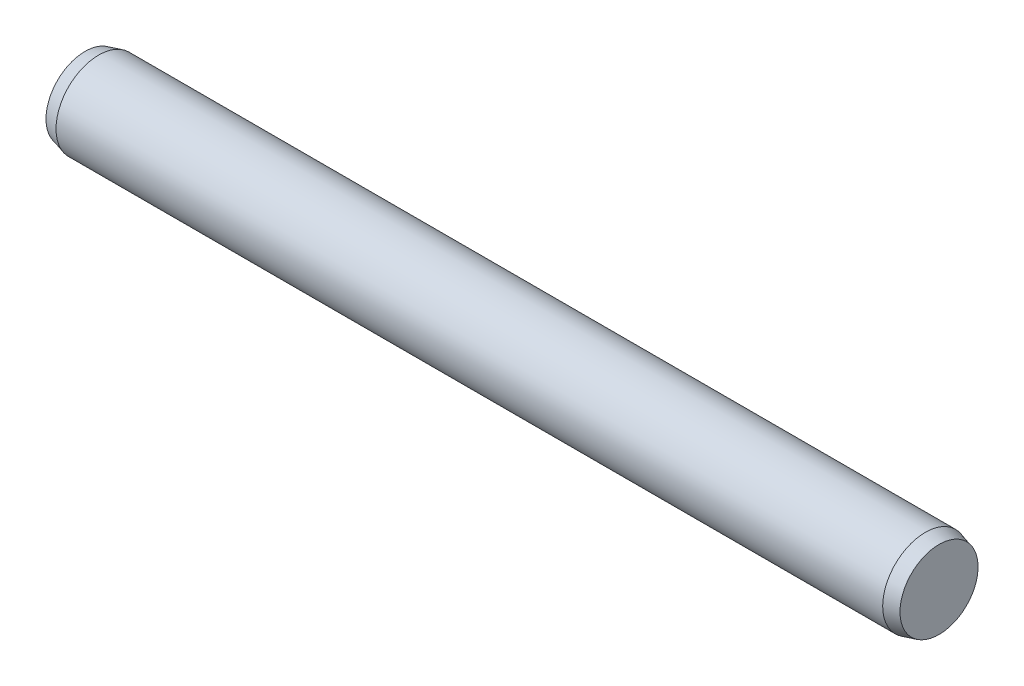
ISO-10303-21;
HEADER;
FILE_DESCRIPTION(('STEP AP214'),'2;1');
FILE_NAME('part.step','',(''),(''),'','','');
FILE_SCHEMA(('AUTOMOTIVE_DESIGN { 1 0 10303 214 1 1 1 1 }'));
ENDSEC;
DATA;
#1=APPLICATION_CONTEXT('core data for automotive mechanical design processes');
#2=APPLICATION_PROTOCOL_DEFINITION('international standard','automotive_design',2000,#1);
#3=PRODUCT_CONTEXT('',#1,'mechanical');
#4=PRODUCT('Part','Part','',(#3));
#5=PRODUCT_RELATED_PRODUCT_CATEGORY('part','',(#4));
#6=PRODUCT_DEFINITION_FORMATION('','',#4);
#7=PRODUCT_DEFINITION_CONTEXT('part definition',#1,'design');
#8=PRODUCT_DEFINITION('design','',#6,#7);
#9=PRODUCT_DEFINITION_SHAPE('','',#8);
#10=(LENGTH_UNIT() NAMED_UNIT(*) SI_UNIT(.MILLI.,.METRE.));
#11=(NAMED_UNIT(*) PLANE_ANGLE_UNIT() SI_UNIT($,.RADIAN.));
#12=(NAMED_UNIT(*) SI_UNIT($,.STERADIAN.) SOLID_ANGLE_UNIT());
#13=UNCERTAINTY_MEASURE_WITH_UNIT(LENGTH_MEASURE(1.E-05),#10,'distance_accuracy_value','');
#14=(GEOMETRIC_REPRESENTATION_CONTEXT(3) GLOBAL_UNCERTAINTY_ASSIGNED_CONTEXT((#13)) GLOBAL_UNIT_ASSIGNED_CONTEXT((#10,
#11,#12)) REPRESENTATION_CONTEXT('',''));
#15=CARTESIAN_POINT('',(0.,0.,0.));
#16=DIRECTION('',(0.,0.,1.));
#17=DIRECTION('',(1.,0.,0.));
#18=AXIS2_PLACEMENT_3D('',#15,#16,#17);
#19=CARTESIAN_POINT('',(0.,2.28564064605508,0.));
#20=DIRECTION('',(1.,0.,0.));
#21=DIRECTION('',(0.,0.,-1.));
#22=AXIS2_PLACEMENT_3D('',#19,#20,#21);
#23=PLANE('',#22);
#24=CARTESIAN_POINT('',(0.,0.,0.));
#25=DIRECTION('',(-1.,0.,0.));
#26=DIRECTION('',(0.,0.,1.));
#27=AXIS2_PLACEMENT_3D('',#24,#25,#26);
#28=CIRCLE('',#27,2.28564064605508);
#29=CARTESIAN_POINT('',(0.,0.,2.28564064605508));
#30=VERTEX_POINT('',#29);
#31=EDGE_CURVE('E45',#30,#30,#28,.T.);
#32=ORIENTED_EDGE('',*,*,#31,.T.);
#33=EDGE_LOOP('',(#32));
#34=FACE_BOUND('',#33,.T.);
#35=ADVANCED_FACE('F31',(#34),#23,.F.);
#36=CARTESIAN_POINT('',(50.,0.,0.));
#37=DIRECTION('',(-1.,0.,0.));
#38=DIRECTION('',(0.,0.,1.));
#39=AXIS2_PLACEMENT_3D('',#36,#37,#38);
#40=PLANE('',#39);
#41=CARTESIAN_POINT('',(50.,0.,0.));
#42=DIRECTION('',(-1.,0.,0.));
#43=DIRECTION('',(0.,0.,1.));
#44=AXIS2_PLACEMENT_3D('',#41,#42,#43);
#45=CIRCLE('',#44,2.28564064605511);
#46=CARTESIAN_POINT('',(50.,0.,2.28564064605511));
#47=VERTEX_POINT('',#46);
#48=EDGE_CURVE('E10',#47,#47,#45,.T.);
#49=ORIENTED_EDGE('',*,*,#48,.F.);
#50=EDGE_LOOP('',(#49));
#51=FACE_BOUND('',#50,.T.);
#52=ADVANCED_FACE('F65',(#51),#40,.F.);
#53=CARTESIAN_POINT('',(50.,0.,0.));
#54=DIRECTION('',(-1.,0.,0.));
#55=DIRECTION('',(0.,0.,1.));
#56=AXIS2_PLACEMENT_3D('',#53,#54,#55);
#57=CONICAL_SURFACE('',#56,2.28564064605511,0.261799387799148);
#58=CARTESIAN_POINT('',(49.2,0.,0.));
#59=DIRECTION('',(-1.,0.,0.));
#60=DIRECTION('',(0.,0.,1.));
#61=AXIS2_PLACEMENT_3D('',#58,#59,#60);
#62=CIRCLE('',#61,2.50000000000001);
#63=CARTESIAN_POINT('',(49.2,0.,2.50000000000001));
#64=VERTEX_POINT('',#63);
#65=EDGE_CURVE('E37',#64,#64,#62,.T.);
#66=ORIENTED_EDGE('',*,*,#65,.F.);
#67=EDGE_LOOP('',(#66));
#68=FACE_BOUND('',#67,.T.);
#69=ORIENTED_EDGE('',*,*,#48,.T.);
#70=EDGE_LOOP('',(#69));
#71=FACE_BOUND('',#70,.T.);
#72=ADVANCED_FACE('F60',(#68,#71),#57,.T.);
#73=CARTESIAN_POINT('',(-6.35,0.,0.));
#74=DIRECTION('',(-1.,0.,0.));
#75=DIRECTION('',(0.,0.,1.));
#76=AXIS2_PLACEMENT_3D('',#73,#74,#75);
#77=CYLINDRICAL_SURFACE('',#76,2.49999999999999);
#78=CARTESIAN_POINT('',(0.8,0.,0.));
#79=DIRECTION('',(-1.,0.,0.));
#80=DIRECTION('',(0.,0.,1.));
#81=AXIS2_PLACEMENT_3D('',#78,#79,#80);
#82=CIRCLE('',#81,2.49999999999997);
#83=CARTESIAN_POINT('',(0.8,0.,2.49999999999997));
#84=VERTEX_POINT('',#83);
#85=EDGE_CURVE('E41',#84,#84,#82,.T.);
#86=ORIENTED_EDGE('',*,*,#85,.F.);
#87=EDGE_LOOP('',(#86));
#88=FACE_BOUND('',#87,.T.);
#89=ORIENTED_EDGE('',*,*,#65,.T.);
#90=EDGE_LOOP('',(#89));
#91=FACE_BOUND('',#90,.T.);
#92=ADVANCED_FACE('F55',(#88,#91),#77,.T.);
#93=CARTESIAN_POINT('',(0.8,0.,0.));
#94=DIRECTION('',(1.,0.,0.));
#95=DIRECTION('',(0.,0.,-1.));
#96=AXIS2_PLACEMENT_3D('',#93,#94,#95);
#97=CONICAL_SURFACE('',#96,2.49999999999997,0.261799387799144);
#98=ORIENTED_EDGE('',*,*,#31,.F.);
#99=EDGE_LOOP('',(#98));
#100=FACE_BOUND('',#99,.T.);
#101=ORIENTED_EDGE('',*,*,#85,.T.);
#102=EDGE_LOOP('',(#101));
#103=FACE_BOUND('',#102,.T.);
#104=ADVANCED_FACE('F52',(#100,#103),#97,.T.);
#105=CLOSED_SHELL('',(#35,#52,#72,#92,#104));
#106=MANIFOLD_SOLID_BREP('B2',#105);
#107=ADVANCED_BREP_SHAPE_REPRESENTATION('',(#18,#106),#14);
#108=SHAPE_DEFINITION_REPRESENTATION(#9,#107);
ENDSEC;
END-ISO-10303-21;
